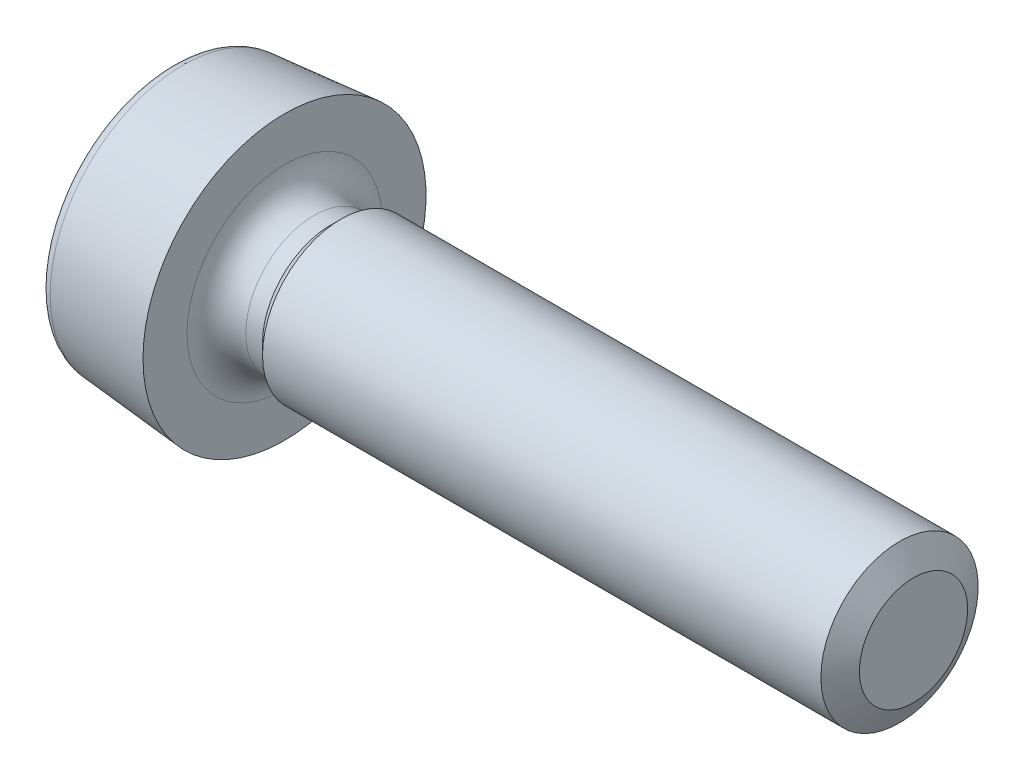
ISO-10303-21;
HEADER;
FILE_DESCRIPTION(('STEP AP214'),'2;1');
FILE_NAME('part.step','',(''),(''),'','','');
FILE_SCHEMA(('AUTOMOTIVE_DESIGN { 1 0 10303 214 1 1 1 1 }'));
ENDSEC;
DATA;
#1=APPLICATION_CONTEXT('core data for automotive mechanical design processes');
#2=APPLICATION_PROTOCOL_DEFINITION('international standard','automotive_design',2000,#1);
#3=PRODUCT_CONTEXT('',#1,'mechanical');
#4=PRODUCT('Part','Part','',(#3));
#5=PRODUCT_RELATED_PRODUCT_CATEGORY('part','',(#4));
#6=PRODUCT_DEFINITION_FORMATION('','',#4);
#7=PRODUCT_DEFINITION_CONTEXT('part definition',#1,'design');
#8=PRODUCT_DEFINITION('design','',#6,#7);
#9=PRODUCT_DEFINITION_SHAPE('','',#8);
#10=(LENGTH_UNIT() NAMED_UNIT(*) SI_UNIT(.MILLI.,.METRE.));
#11=(NAMED_UNIT(*) PLANE_ANGLE_UNIT() SI_UNIT($,.RADIAN.));
#12=(NAMED_UNIT(*) SI_UNIT($,.STERADIAN.) SOLID_ANGLE_UNIT());
#13=UNCERTAINTY_MEASURE_WITH_UNIT(LENGTH_MEASURE(1.E-05),#10,'distance_accuracy_value','');
#14=(GEOMETRIC_REPRESENTATION_CONTEXT(3) GLOBAL_UNCERTAINTY_ASSIGNED_CONTEXT((#13)) GLOBAL_UNIT_ASSIGNED_CONTEXT((#10,
#11,#12)) REPRESENTATION_CONTEXT('',''));
#15=CARTESIAN_POINT('',(0.,0.,0.));
#16=DIRECTION('',(0.,0.,1.));
#17=DIRECTION('',(1.,0.,0.));
#18=AXIS2_PLACEMENT_3D('',#15,#16,#17);
#19=CARTESIAN_POINT('',(0.,1.90925417084986,0.));
#20=DIRECTION('',(1.,0.,0.));
#21=DIRECTION('',(0.,0.,-1.));
#22=AXIS2_PLACEMENT_3D('',#19,#20,#21);
#23=PLANE('',#22);
#24=CARTESIAN_POINT('',(0.,0.,0.));
#25=DIRECTION('',(-1.,0.,0.));
#26=DIRECTION('',(0.,0.,1.));
#27=AXIS2_PLACEMENT_3D('',#24,#25,#26);
#28=CIRCLE('',#27,1.90925417084986);
#29=CARTESIAN_POINT('',(0.,0.,1.90925417084986));
#30=VERTEX_POINT('',#29);
#31=EDGE_CURVE('E171',#30,#30,#28,.T.);
#32=ORIENTED_EDGE('',*,*,#31,.T.);
#33=EDGE_LOOP('',(#32));
#34=FACE_BOUND('',#33,.T.);
#35=DIRECTION('',(0.,0.,1.));
#36=VECTOR('',#35,1.);
#37=CARTESIAN_POINT('',(0.,-0.225000000000005,1.35));
#38=LINE('',#37,#36);
#39=CARTESIAN_POINT('',(0.,-0.225000000000001,0.225));
#40=VERTEX_POINT('',#39);
#41=CARTESIAN_POINT('',(0.,-0.225000000000005,1.35));
#42=VERTEX_POINT('',#41);
#43=EDGE_CURVE('E137',#40,#42,#38,.T.);
#44=ORIENTED_EDGE('',*,*,#43,.F.);
#45=DIRECTION('',(0.,1.,0.));
#46=VECTOR('',#45,1.);
#47=CARTESIAN_POINT('',(0.,1.35,0.225));
#48=LINE('',#47,#46);
#49=CARTESIAN_POINT('',(0.,-1.35,0.225));
#50=VERTEX_POINT('',#49);
#51=EDGE_CURVE('E156',#50,#40,#48,.T.);
#52=ORIENTED_EDGE('',*,*,#51,.F.);
#53=DIRECTION('',(0.,0.,1.));
#54=VECTOR('',#53,1.);
#55=CARTESIAN_POINT('',(0.,-1.35,-0.225));
#56=LINE('',#55,#54);
#57=CARTESIAN_POINT('',(0.,-1.35,-0.225));
#58=VERTEX_POINT('',#57);
#59=EDGE_CURVE('E148',#58,#50,#56,.T.);
#60=ORIENTED_EDGE('',*,*,#59,.F.);
#61=DIRECTION('',(0.,-1.,0.));
#62=VECTOR('',#61,1.);
#63=CARTESIAN_POINT('',(0.,1.35,-0.225));
#64=LINE('',#63,#62);
#65=CARTESIAN_POINT('',(0.,-0.224999999999999,-0.225));
#66=VERTEX_POINT('',#65);
#67=EDGE_CURVE('E80',#66,#58,#64,.T.);
#68=ORIENTED_EDGE('',*,*,#67,.F.);
#69=CARTESIAN_POINT('',(0.,-0.224999999999995,-1.35));
#70=VERTEX_POINT('',#69);
#71=EDGE_CURVE('E95',#70,#66,#38,.T.);
#72=ORIENTED_EDGE('',*,*,#71,.F.);
#73=DIRECTION('',(0.,-1.,0.));
#74=VECTOR('',#73,1.);
#75=CARTESIAN_POINT('',(0.,0.225000000000005,-1.35));
#76=LINE('',#75,#74);
#77=CARTESIAN_POINT('',(0.,0.225000000000005,-1.35));
#78=VERTEX_POINT('',#77);
#79=EDGE_CURVE('E133',#78,#70,#76,.T.);
#80=ORIENTED_EDGE('',*,*,#79,.F.);
#81=DIRECTION('',(0.,0.,-1.));
#82=VECTOR('',#81,1.);
#83=CARTESIAN_POINT('',(0.,0.224999999999995,1.35));
#84=LINE('',#83,#82);
#85=CARTESIAN_POINT('',(0.,0.225000000000001,-0.225));
#86=VERTEX_POINT('',#85);
#87=EDGE_CURVE('E134',#86,#78,#84,.T.);
#88=ORIENTED_EDGE('',*,*,#87,.F.);
#89=CARTESIAN_POINT('',(0.,1.35,-0.225));
#90=VERTEX_POINT('',#89);
#91=EDGE_CURVE('E151',#90,#86,#64,.T.);
#92=ORIENTED_EDGE('',*,*,#91,.F.);
#93=DIRECTION('',(0.,0.,-1.));
#94=VECTOR('',#93,1.);
#95=CARTESIAN_POINT('',(0.,1.35,-0.225));
#96=LINE('',#95,#94);
#97=CARTESIAN_POINT('',(0.,1.35,0.225));
#98=VERTEX_POINT('',#97);
#99=EDGE_CURVE('E153',#98,#90,#96,.T.);
#100=ORIENTED_EDGE('',*,*,#99,.F.);
#101=CARTESIAN_POINT('',(0.,0.224999999999999,0.225));
#102=VERTEX_POINT('',#101);
#103=EDGE_CURVE('E65',#102,#98,#48,.T.);
#104=ORIENTED_EDGE('',*,*,#103,.F.);
#105=CARTESIAN_POINT('',(0.,0.224999999999995,1.35));
#106=VERTEX_POINT('',#105);
#107=EDGE_CURVE('E127',#106,#102,#84,.T.);
#108=ORIENTED_EDGE('',*,*,#107,.F.);
#109=DIRECTION('',(0.,1.,0.));
#110=VECTOR('',#109,1.);
#111=CARTESIAN_POINT('',(0.,0.224999999999995,1.35));
#112=LINE('',#111,#110);
#113=EDGE_CURVE('E115',#42,#106,#112,.T.);
#114=ORIENTED_EDGE('',*,*,#113,.F.);
#115=EDGE_LOOP('',(#44,#52,#60,#68,#72,#80,#88,#92,#100,#104,#108,#114));
#116=FACE_BOUND('',#115,.T.);
#117=ADVANCED_FACE('F42',(#34,#116),#23,.F.);
#118=CARTESIAN_POINT('',(1.2,0.,0.));
#119=DIRECTION('',(-0.184288535050185,0.,-0.982872186934322));
#120=DIRECTION('',(-0.982872186934322,0.,0.184288535050185));
#121=AXIS2_PLACEMENT_3D('',#118,#119,#120);
#122=PLANE('',#121);
#123=ORIENTED_EDGE('',*,*,#51,.T.);
#124=DIRECTION('',(0.966595349328283,0.181236627999054,-0.181236627999053));
#125=VECTOR('',#124,1.);
#126=CARTESIAN_POINT('',(1.2,0.,0.));
#127=LINE('',#126,#125);
#128=CARTESIAN_POINT('',(1.2,0.,0.));
#129=VERTEX_POINT('',#128);
#130=EDGE_CURVE('E87',#40,#129,#127,.T.);
#131=ORIENTED_EDGE('',*,*,#130,.T.);
#132=DIRECTION('',(0.659268514744263,0.741677079087296,-0.123612846514549));
#133=VECTOR('',#132,1.);
#134=CARTESIAN_POINT('',(0.,-1.35,0.225));
#135=LINE('',#134,#133);
#136=EDGE_CURVE('E161',#50,#129,#135,.T.);
#137=ORIENTED_EDGE('',*,*,#136,.F.);
#138=EDGE_LOOP('',(#123,#131,#137));
#139=FACE_BOUND('',#138,.T.);
#140=ADVANCED_FACE('F205',(#139),#122,.T.);
#141=DIRECTION('',(0.659268514744263,-0.741677079087296,-0.123612846514549));
#142=VECTOR('',#141,1.);
#143=CARTESIAN_POINT('',(0.,1.35,0.225));
#144=LINE('',#143,#142);
#145=EDGE_CURVE('E159',#98,#129,#144,.T.);
#146=ORIENTED_EDGE('',*,*,#145,.T.);
#147=DIRECTION('',(-0.966595349328283,0.181236627999053,0.181236627999053));
#148=VECTOR('',#147,1.);
#149=CARTESIAN_POINT('',(1.2,0.,0.));
#150=LINE('',#149,#148);
#151=EDGE_CURVE('E123',#129,#102,#150,.T.);
#152=ORIENTED_EDGE('',*,*,#151,.T.);
#153=ORIENTED_EDGE('',*,*,#103,.T.);
#154=EDGE_LOOP('',(#146,#152,#153));
#155=FACE_BOUND('',#154,.T.);
#156=ADVANCED_FACE('F198',(#155),#122,.T.);
#157=CARTESIAN_POINT('',(1.2,0.,0.));
#158=DIRECTION('',(-0.184288535050185,0.,0.982872186934322));
#159=DIRECTION('',(0.982872186934322,0.,0.184288535050185));
#160=AXIS2_PLACEMENT_3D('',#157,#158,#159);
#161=PLANE('',#160);
#162=DIRECTION('',(0.659268514744263,0.741677079087296,0.123612846514549));
#163=VECTOR('',#162,1.);
#164=CARTESIAN_POINT('',(0.,-1.35,-0.225));
#165=LINE('',#164,#163);
#166=EDGE_CURVE('E147',#58,#129,#165,.T.);
#167=ORIENTED_EDGE('',*,*,#166,.T.);
#168=DIRECTION('',(-0.966595349328283,-0.181236627999053,-0.181236627999053));
#169=VECTOR('',#168,1.);
#170=CARTESIAN_POINT('',(1.2,0.,0.));
#171=LINE('',#170,#169);
#172=EDGE_CURVE('E11',#129,#66,#171,.T.);
#173=ORIENTED_EDGE('',*,*,#172,.T.);
#174=ORIENTED_EDGE('',*,*,#67,.T.);
#175=EDGE_LOOP('',(#167,#173,#174));
#176=FACE_BOUND('',#175,.T.);
#177=ADVANCED_FACE('F199',(#176),#161,.T.);
#178=ORIENTED_EDGE('',*,*,#91,.T.);
#179=DIRECTION('',(0.966595349328283,-0.181236627999054,0.181236627999053));
#180=VECTOR('',#179,1.);
#181=CARTESIAN_POINT('',(1.2,0.,0.));
#182=LINE('',#181,#180);
#183=EDGE_CURVE('E49',#86,#129,#182,.T.);
#184=ORIENTED_EDGE('',*,*,#183,.T.);
#185=DIRECTION('',(0.659268514744263,-0.741677079087296,0.123612846514549));
#186=VECTOR('',#185,1.);
#187=CARTESIAN_POINT('',(0.,1.35,-0.225));
#188=LINE('',#187,#186);
#189=EDGE_CURVE('E56',#90,#129,#188,.T.);
#190=ORIENTED_EDGE('',*,*,#189,.F.);
#191=EDGE_LOOP('',(#178,#184,#190));
#192=FACE_BOUND('',#191,.T.);
#193=ADVANCED_FACE('F192',(#192),#161,.T.);
#194=CARTESIAN_POINT('',(-2.16958058991907,0.,0.));
#195=DIRECTION('',(-1.,0.,0.));
#196=DIRECTION('',(0.,0.,1.));
#197=AXIS2_PLACEMENT_3D('',#194,#195,#196);
#198=CYLINDRICAL_SURFACE('',#197,1.25);
#199=CARTESIAN_POINT('',(2.7,0.,0.));
#200=DIRECTION('',(-1.,0.,0.));
#201=DIRECTION('',(0.,0.,1.));
#202=AXIS2_PLACEMENT_3D('',#199,#200,#201);
#203=CIRCLE('',#202,1.25);
#204=CARTESIAN_POINT('',(2.7,0.,1.25));
#205=VERTEX_POINT('',#204);
#206=EDGE_CURVE('E190',#205,#205,#203,.T.);
#207=ORIENTED_EDGE('',*,*,#206,.F.);
#208=EDGE_LOOP('',(#207));
#209=FACE_BOUND('',#208,.T.);
#210=CARTESIAN_POINT('',(11.5774372025849,0.,0.));
#211=DIRECTION('',(-1.,0.,0.));
#212=DIRECTION('',(0.,0.,1.));
#213=AXIS2_PLACEMENT_3D('',#210,#211,#212);
#214=CIRCLE('',#213,1.25);
#215=CARTESIAN_POINT('',(11.5774372025849,0.,1.25));
#216=VERTEX_POINT('',#215);
#217=EDGE_CURVE('E168',#216,#216,#214,.T.);
#218=ORIENTED_EDGE('',*,*,#217,.T.);
#219=EDGE_LOOP('',(#218));
#220=FACE_BOUND('',#219,.T.);
#221=ADVANCED_FACE('F263',(#209,#220),#198,.T.);
#222=CARTESIAN_POINT('',(2.7,0.,0.));
#223=DIRECTION('',(1.,0.,0.));
#224=DIRECTION('',(0.,0.,-1.));
#225=AXIS2_PLACEMENT_3D('',#222,#223,#224);
#226=CONICAL_SURFACE('',#225,1.25,0.785398163397442);
#227=CARTESIAN_POINT('',(2.5325,0.,0.));
#228=DIRECTION('',(-1.,0.,0.));
#229=DIRECTION('',(0.,0.,1.));
#230=AXIS2_PLACEMENT_3D('',#227,#228,#229);
#231=CIRCLE('',#230,1.0825);
#232=CARTESIAN_POINT('',(2.5325,0.,1.0825));
#233=VERTEX_POINT('',#232);
#234=EDGE_CURVE('E187',#233,#233,#231,.T.);
#235=ORIENTED_EDGE('',*,*,#234,.F.);
#236=EDGE_LOOP('',(#235));
#237=FACE_BOUND('',#236,.T.);
#238=ORIENTED_EDGE('',*,*,#206,.T.);
#239=EDGE_LOOP('',(#238));
#240=FACE_BOUND('',#239,.T.);
#241=ADVANCED_FACE('F257',(#237,#240),#226,.T.);
#242=CARTESIAN_POINT('',(-2.16958058991907,0.,0.));
#243=DIRECTION('',(-1.,0.,0.));
#244=DIRECTION('',(0.,0.,1.));
#245=AXIS2_PLACEMENT_3D('',#242,#243,#244);
#246=CYLINDRICAL_SURFACE('',#245,1.0825);
#247=CARTESIAN_POINT('',(2.2675,0.,0.));
#248=DIRECTION('',(-1.,0.,0.));
#249=DIRECTION('',(0.,0.,1.));
#250=AXIS2_PLACEMENT_3D('',#247,#248,#249);
#251=CIRCLE('',#250,1.0825);
#252=CARTESIAN_POINT('',(2.2675,0.,1.0825));
#253=VERTEX_POINT('',#252);
#254=EDGE_CURVE('E184',#253,#253,#251,.T.);
#255=ORIENTED_EDGE('',*,*,#254,.F.);
#256=EDGE_LOOP('',(#255));
#257=FACE_BOUND('',#256,.T.);
#258=ORIENTED_EDGE('',*,*,#234,.T.);
#259=EDGE_LOOP('',(#258));
#260=FACE_BOUND('',#259,.T.);
#261=ADVANCED_FACE('F251',(#257,#260),#246,.T.);
#262=CARTESIAN_POINT('',(2.2675,0.,0.));
#263=DIRECTION('',(-1.,0.,0.));
#264=DIRECTION('',(0.,0.,1.));
#265=AXIS2_PLACEMENT_3D('',#262,#263,#264);
#266=TOROIDAL_SURFACE('',#265,1.55,0.4675);
#267=CARTESIAN_POINT('',(1.8,0.,0.));
#268=DIRECTION('',(-1.,0.,0.));
#269=DIRECTION('',(0.,0.,1.));
#270=AXIS2_PLACEMENT_3D('',#267,#268,#269);
#271=CIRCLE('',#270,1.55);
#272=CARTESIAN_POINT('',(1.8,0.,1.55));
#273=VERTEX_POINT('',#272);
#274=EDGE_CURVE('E181',#273,#273,#271,.T.);
#275=ORIENTED_EDGE('',*,*,#274,.F.);
#276=EDGE_LOOP('',(#275));
#277=FACE_BOUND('',#276,.T.);
#278=ORIENTED_EDGE('',*,*,#254,.T.);
#279=EDGE_LOOP('',(#278));
#280=FACE_BOUND('',#279,.T.);
#281=ADVANCED_FACE('F245',(#277,#280),#266,.F.);
#282=CARTESIAN_POINT('',(1.8,1.55,0.));
#283=DIRECTION('',(-1.,0.,0.));
#284=DIRECTION('',(0.,0.,1.));
#285=AXIS2_PLACEMENT_3D('',#282,#283,#284);
#286=PLANE('',#285);
#287=CARTESIAN_POINT('',(1.8,0.,0.));
#288=DIRECTION('',(-1.,0.,0.));
#289=DIRECTION('',(0.,0.,1.));
#290=AXIS2_PLACEMENT_3D('',#287,#288,#289);
#291=CIRCLE('',#290,2.25);
#292=CARTESIAN_POINT('',(1.8,0.,2.25));
#293=VERTEX_POINT('',#292);
#294=EDGE_CURVE('E177',#293,#293,#291,.T.);
#295=ORIENTED_EDGE('',*,*,#294,.F.);
#296=EDGE_LOOP('',(#295));
#297=FACE_BOUND('',#296,.T.);
#298=ORIENTED_EDGE('',*,*,#274,.T.);
#299=EDGE_LOOP('',(#298));
#300=FACE_BOUND('',#299,.T.);
#301=ADVANCED_FACE('F239',(#297,#300),#286,.F.);
#302=CARTESIAN_POINT('',(1.8,0.,0.));
#303=DIRECTION('',(1.,0.,0.));
#304=DIRECTION('',(0.,0.,-1.));
#305=AXIS2_PLACEMENT_3D('',#302,#303,#304);
#306=CONICAL_SURFACE('',#305,2.25,0.0872664625997097);
#307=CARTESIAN_POINT('',(0.18256885145047,0.,0.));
#308=DIRECTION('',(-1.,0.,0.));
#309=DIRECTION('',(0.,0.,1.));
#310=AXIS2_PLACEMENT_3D('',#307,#308,#309);
#311=CIRCLE('',#310,2.10849311046821);
#312=CARTESIAN_POINT('',(0.18256885145047,0.,2.10849311046821));
#313=VERTEX_POINT('',#312);
#314=EDGE_CURVE('E174',#313,#313,#311,.T.);
#315=ORIENTED_EDGE('',*,*,#314,.F.);
#316=EDGE_LOOP('',(#315));
#317=FACE_BOUND('',#316,.T.);
#318=ORIENTED_EDGE('',*,*,#294,.T.);
#319=EDGE_LOOP('',(#318));
#320=FACE_BOUND('',#319,.T.);
#321=ADVANCED_FACE('F233',(#317,#320),#306,.T.);
#322=CARTESIAN_POINT('',(0.2,0.,0.));
#323=DIRECTION('',(-1.,0.,0.));
#324=DIRECTION('',(0.,0.,1.));
#325=AXIS2_PLACEMENT_3D('',#322,#323,#324);
#326=TOROIDAL_SURFACE('',#325,1.90925417084986,0.2);
#327=ORIENTED_EDGE('',*,*,#31,.F.);
#328=EDGE_LOOP('',(#327));
#329=FACE_BOUND('',#328,.T.);
#330=ORIENTED_EDGE('',*,*,#314,.T.);
#331=EDGE_LOOP('',(#330));
#332=FACE_BOUND('',#331,.T.);
#333=ADVANCED_FACE('F229',(#329,#332),#326,.T.);
#334=CARTESIAN_POINT('',(11.5774372025849,0.,0.));
#335=DIRECTION('',(-1.,0.,0.));
#336=DIRECTION('',(0.,0.,1.));
#337=AXIS2_PLACEMENT_3D('',#334,#335,#336);
#338=CONICAL_SURFACE('',#337,1.25,1.05188801855281);
#339=CARTESIAN_POINT('',(11.8,0.,0.));
#340=DIRECTION('',(-1.,0.,0.));
#341=DIRECTION('',(0.,0.,1.));
#342=AXIS2_PLACEMENT_3D('',#339,#340,#341);
#343=CIRCLE('',#342,0.860299999999999);
#344=CARTESIAN_POINT('',(11.8,0.,0.860299999999999));
#345=VERTEX_POINT('',#344);
#346=EDGE_CURVE('E155',#345,#345,#343,.T.);
#347=ORIENTED_EDGE('',*,*,#346,.T.);
#348=EDGE_LOOP('',(#347));
#349=FACE_BOUND('',#348,.T.);
#350=ORIENTED_EDGE('',*,*,#217,.F.);
#351=EDGE_LOOP('',(#350));
#352=FACE_BOUND('',#351,.T.);
#353=ADVANCED_FACE('F232',(#349,#352),#338,.T.);
#354=CARTESIAN_POINT('',(11.8,0.,0.));
#355=DIRECTION('',(-1.,0.,0.));
#356=DIRECTION('',(0.,0.,1.));
#357=AXIS2_PLACEMENT_3D('',#354,#355,#356);
#358=PLANE('',#357);
#359=ORIENTED_EDGE('',*,*,#346,.F.);
#360=EDGE_LOOP('',(#359));
#361=FACE_BOUND('',#360,.T.);
#362=ADVANCED_FACE('F273',(#361),#358,.F.);
#363=CARTESIAN_POINT('',(0.,1.35,0.225));
#364=DIRECTION('',(0.74740931868366,0.66436383882992,0.));
#365=DIRECTION('',(-0.66436383882992,0.74740931868366,0.));
#366=AXIS2_PLACEMENT_3D('',#363,#364,#365);
#367=PLANE('',#366);
#368=ORIENTED_EDGE('',*,*,#145,.F.);
#369=ORIENTED_EDGE('',*,*,#99,.T.);
#370=ORIENTED_EDGE('',*,*,#189,.T.);
#371=EDGE_LOOP('',(#368,#369,#370));
#372=FACE_BOUND('',#371,.T.);
#373=ADVANCED_FACE('F197',(#372),#367,.F.);
#374=CARTESIAN_POINT('',(0.,-1.35,-0.225));
#375=DIRECTION('',(0.74740931868366,-0.66436383882992,0.));
#376=DIRECTION('',(0.66436383882992,0.74740931868366,0.));
#377=AXIS2_PLACEMENT_3D('',#374,#375,#376);
#378=PLANE('',#377);
#379=ORIENTED_EDGE('',*,*,#166,.F.);
#380=ORIENTED_EDGE('',*,*,#59,.T.);
#381=ORIENTED_EDGE('',*,*,#136,.T.);
#382=EDGE_LOOP('',(#379,#380,#381));
#383=FACE_BOUND('',#382,.T.);
#384=ADVANCED_FACE('F202',(#383),#378,.F.);
#385=CARTESIAN_POINT('',(1.2,0.,0.));
#386=DIRECTION('',(-0.184288535050185,0.982872186934322,0.));
#387=DIRECTION('',(-0.982872186934322,-0.184288535050185,0.));
#388=AXIS2_PLACEMENT_3D('',#385,#386,#387);
#389=PLANE('',#388);
#390=DIRECTION('',(0.659268514744263,0.123612846514547,0.741677079087297));
#391=VECTOR('',#390,1.);
#392=CARTESIAN_POINT('',(0.,-0.224999999999995,-1.35));
#393=LINE('',#392,#391);
#394=EDGE_CURVE('E129',#70,#129,#393,.T.);
#395=ORIENTED_EDGE('',*,*,#394,.F.);
#396=ORIENTED_EDGE('',*,*,#71,.T.);
#397=ORIENTED_EDGE('',*,*,#172,.F.);
#398=EDGE_LOOP('',(#395,#396,#397));
#399=FACE_BOUND('',#398,.T.);
#400=ADVANCED_FACE('F210',(#399),#389,.T.);
#401=CARTESIAN_POINT('',(1.2,0.,0.));
#402=DIRECTION('',(-0.184288535050185,-0.982872186934322,0.));
#403=DIRECTION('',(0.982872186934322,-0.184288535050185,0.));
#404=AXIS2_PLACEMENT_3D('',#401,#402,#403);
#405=PLANE('',#404);
#406=ORIENTED_EDGE('',*,*,#87,.T.);
#407=DIRECTION('',(0.659268514744263,-0.123612846514552,0.741677079087296));
#408=VECTOR('',#407,1.);
#409=CARTESIAN_POINT('',(0.,0.225000000000005,-1.35));
#410=LINE('',#409,#408);
#411=EDGE_CURVE('E130',#78,#129,#410,.T.);
#412=ORIENTED_EDGE('',*,*,#411,.T.);
#413=ORIENTED_EDGE('',*,*,#183,.F.);
#414=EDGE_LOOP('',(#406,#412,#413));
#415=FACE_BOUND('',#414,.T.);
#416=ADVANCED_FACE('F216',(#415),#405,.T.);
#417=CARTESIAN_POINT('',(0.,0.225000000000005,-1.35));
#418=DIRECTION('',(0.74740931868366,0.,-0.66436383882992));
#419=DIRECTION('',(0.66436383882992,0.,0.74740931868366));
#420=AXIS2_PLACEMENT_3D('',#417,#418,#419);
#421=PLANE('',#420);
#422=ORIENTED_EDGE('',*,*,#411,.F.);
#423=ORIENTED_EDGE('',*,*,#79,.T.);
#424=ORIENTED_EDGE('',*,*,#394,.T.);
#425=EDGE_LOOP('',(#422,#423,#424));
#426=FACE_BOUND('',#425,.T.);
#427=ADVANCED_FACE('F208',(#426),#421,.F.);
#428=ORIENTED_EDGE('',*,*,#43,.T.);
#429=DIRECTION('',(0.659268514744263,0.123612846514552,-0.741677079087296));
#430=VECTOR('',#429,1.);
#431=CARTESIAN_POINT('',(0.,-0.225000000000005,1.35));
#432=LINE('',#431,#430);
#433=EDGE_CURVE('E120',#42,#129,#432,.T.);
#434=ORIENTED_EDGE('',*,*,#433,.T.);
#435=ORIENTED_EDGE('',*,*,#130,.F.);
#436=EDGE_LOOP('',(#428,#434,#435));
#437=FACE_BOUND('',#436,.T.);
#438=ADVANCED_FACE('F206',(#437),#389,.T.);
#439=DIRECTION('',(0.659268514744263,-0.123612846514547,-0.741677079087297));
#440=VECTOR('',#439,1.);
#441=CARTESIAN_POINT('',(0.,0.224999999999995,1.35));
#442=LINE('',#441,#440);
#443=EDGE_CURVE('E118',#106,#129,#442,.T.);
#444=ORIENTED_EDGE('',*,*,#443,.F.);
#445=ORIENTED_EDGE('',*,*,#107,.T.);
#446=ORIENTED_EDGE('',*,*,#151,.F.);
#447=EDGE_LOOP('',(#444,#445,#446));
#448=FACE_BOUND('',#447,.T.);
#449=ADVANCED_FACE('F126',(#448),#405,.T.);
#450=CARTESIAN_POINT('',(0.,-0.225000000000005,1.35));
#451=DIRECTION('',(0.74740931868366,0.,0.66436383882992));
#452=DIRECTION('',(-0.66436383882992,0.,0.74740931868366));
#453=AXIS2_PLACEMENT_3D('',#450,#451,#452);
#454=PLANE('',#453);
#455=ORIENTED_EDGE('',*,*,#433,.F.);
#456=ORIENTED_EDGE('',*,*,#113,.T.);
#457=ORIENTED_EDGE('',*,*,#443,.T.);
#458=EDGE_LOOP('',(#455,#456,#457));
#459=FACE_BOUND('',#458,.T.);
#460=ADVANCED_FACE('F117',(#459),#454,.F.);
#461=CLOSED_SHELL('',(#117,#140,#156,#177,#193,#221,#241,#261,#281,#301,#321,#333,#353,#362,
#373,#384,#400,#416,#427,#438,#449,#460));
#462=MANIFOLD_SOLID_BREP('B2',#461);
#463=ADVANCED_BREP_SHAPE_REPRESENTATION('',(#18,#462),#14);
#464=SHAPE_DEFINITION_REPRESENTATION(#9,#463);
ENDSEC;
END-ISO-10303-21;
